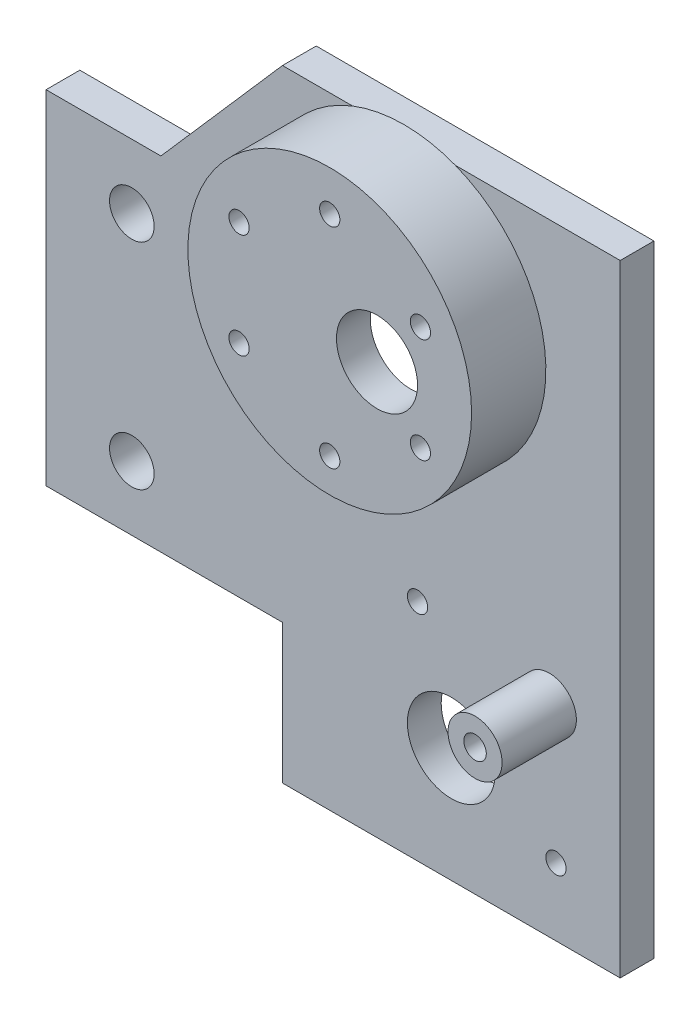
ISO-10303-21;
HEADER;
FILE_DESCRIPTION(('STEP AP214'),'2;1');
FILE_NAME('part.step','',(''),(''),'','','');
FILE_SCHEMA(('AUTOMOTIVE_DESIGN { 1 0 10303 214 1 1 1 1 }'));
ENDSEC;
DATA;
#1=APPLICATION_CONTEXT('core data for automotive mechanical design processes');
#2=APPLICATION_PROTOCOL_DEFINITION('international standard','automotive_design',2000,#1);
#3=PRODUCT_CONTEXT('',#1,'mechanical');
#4=PRODUCT('Part','Part','',(#3));
#5=PRODUCT_RELATED_PRODUCT_CATEGORY('part','',(#4));
#6=PRODUCT_DEFINITION_FORMATION('','',#4);
#7=PRODUCT_DEFINITION_CONTEXT('part definition',#1,'design');
#8=PRODUCT_DEFINITION('design','',#6,#7);
#9=PRODUCT_DEFINITION_SHAPE('','',#8);
#10=(LENGTH_UNIT() NAMED_UNIT(*) SI_UNIT(.MILLI.,.METRE.));
#11=(NAMED_UNIT(*) PLANE_ANGLE_UNIT() SI_UNIT($,.RADIAN.));
#12=(NAMED_UNIT(*) SI_UNIT($,.STERADIAN.) SOLID_ANGLE_UNIT());
#13=UNCERTAINTY_MEASURE_WITH_UNIT(LENGTH_MEASURE(1.E-05),#10,'distance_accuracy_value','');
#14=(GEOMETRIC_REPRESENTATION_CONTEXT(3) GLOBAL_UNCERTAINTY_ASSIGNED_CONTEXT((#13)) GLOBAL_UNIT_ASSIGNED_CONTEXT((#10,
#11,#12)) REPRESENTATION_CONTEXT('',''));
#15=CARTESIAN_POINT('',(0.,0.,0.));
#16=DIRECTION('',(0.,0.,1.));
#17=DIRECTION('',(1.,0.,0.));
#18=AXIS2_PLACEMENT_3D('',#15,#16,#17);
#19=CARTESIAN_POINT('',(-60.,54.4,0.));
#20=DIRECTION('',(0.,-1.,0.));
#21=DIRECTION('',(1.,0.,0.));
#22=AXIS2_PLACEMENT_3D('',#19,#20,#21);
#23=PLANE('',#22);
#24=DIRECTION('',(0.,0.,-1.));
#25=VECTOR('',#24,1.);
#26=CARTESIAN_POINT('',(-42.9961508644975,54.4,32.3536367954565));
#27=LINE('',#26,#25);
#28=CARTESIAN_POINT('',(-42.9961508644975,54.4,4.99999999999999));
#29=VERTEX_POINT('',#28);
#30=CARTESIAN_POINT('',(-42.9961508644975,54.4,0.));
#31=VERTEX_POINT('',#30);
#32=EDGE_CURVE('E60',#29,#31,#27,.T.);
#33=ORIENTED_EDGE('',*,*,#32,.T.);
#34=DIRECTION('',(1.,0.,0.));
#35=VECTOR('',#34,1.);
#36=CARTESIAN_POINT('',(-60.,54.4,0.));
#37=LINE('',#36,#35);
#38=CARTESIAN_POINT('',(-60.,54.4,0.));
#39=VERTEX_POINT('',#38);
#40=EDGE_CURVE('E168',#39,#31,#37,.T.);
#41=ORIENTED_EDGE('',*,*,#40,.F.);
#42=DIRECTION('',(0.,0.,-1.));
#43=VECTOR('',#42,1.);
#44=CARTESIAN_POINT('',(-60.,54.4,0.));
#45=LINE('',#44,#43);
#46=CARTESIAN_POINT('',(-60.,54.4,4.99999999999999));
#47=VERTEX_POINT('',#46);
#48=EDGE_CURVE('E166',#47,#39,#45,.T.);
#49=ORIENTED_EDGE('',*,*,#48,.F.);
#50=DIRECTION('',(1.,0.,0.));
#51=VECTOR('',#50,1.);
#52=CARTESIAN_POINT('',(-60.,54.4,4.99999999999999));
#53=LINE('',#52,#51);
#54=EDGE_CURVE('E56',#47,#29,#53,.T.);
#55=ORIENTED_EDGE('',*,*,#54,.T.);
#56=EDGE_LOOP('',(#33,#41,#49,#55));
#57=FACE_BOUND('',#56,.T.);
#58=ADVANCED_FACE('F40',(#57),#23,.F.);
#59=CARTESIAN_POINT('',(-25.,-45.,-60.));
#60=DIRECTION('',(1.,0.,0.));
#61=DIRECTION('',(0.,1.,0.));
#62=AXIS2_PLACEMENT_3D('',#59,#60,#61);
#63=PLANE('',#62);
#64=DIRECTION('',(0.,0.,1.));
#65=VECTOR('',#64,1.);
#66=CARTESIAN_POINT('',(-25.,3.6,0.));
#67=LINE('',#66,#65);
#68=CARTESIAN_POINT('',(-25.,3.60000000000001,0.));
#69=VERTEX_POINT('',#68);
#70=CARTESIAN_POINT('',(-25.,3.60000000000001,4.99999999999999));
#71=VERTEX_POINT('',#70);
#72=EDGE_CURVE('E153',#69,#71,#67,.T.);
#73=ORIENTED_EDGE('',*,*,#72,.F.);
#74=DIRECTION('',(0.,-1.,0.));
#75=VECTOR('',#74,1.);
#76=CARTESIAN_POINT('',(-25.,-45.,0.));
#77=LINE('',#76,#75);
#78=CARTESIAN_POINT('',(-25.,-17.,0.));
#79=VERTEX_POINT('',#78);
#80=EDGE_CURVE('E192',#69,#79,#77,.T.);
#81=ORIENTED_EDGE('',*,*,#80,.T.);
#82=DIRECTION('',(0.,0.,1.));
#83=VECTOR('',#82,1.);
#84=CARTESIAN_POINT('',(-25.,-17.,-2.49999999929126E-05));
#85=LINE('',#84,#83);
#86=CARTESIAN_POINT('',(-25.,-17.,4.99999999999999));
#87=VERTEX_POINT('',#86);
#88=EDGE_CURVE('E186',#79,#87,#85,.T.);
#89=ORIENTED_EDGE('',*,*,#88,.T.);
#90=DIRECTION('',(0.,1.,0.));
#91=VECTOR('',#90,1.);
#92=CARTESIAN_POINT('',(-25.,25.,4.99999999999999));
#93=LINE('',#92,#91);
#94=EDGE_CURVE('E225',#87,#71,#93,.T.);
#95=ORIENTED_EDGE('',*,*,#94,.T.);
#96=EDGE_LOOP('',(#73,#81,#89,#95));
#97=FACE_BOUND('',#96,.T.);
#98=ADVANCED_FACE('F255',(#97),#63,.F.);
#99=CARTESIAN_POINT('',(-20.,-25.,4.99999999999999));
#100=DIRECTION('',(0.,0.,-1.));
#101=DIRECTION('',(-1.,0.,0.));
#102=AXIS2_PLACEMENT_3D('',#99,#100,#101);
#103=PLANE('',#102);
#104=CARTESIAN_POINT('',(-7.00000000000005,55.425998351102,4.99999999999999));
#105=DIRECTION('',(0.,0.,1.));
#106=DIRECTION('',(1.,0.,0.));
#107=AXIS2_PLACEMENT_3D('',#104,#105,#106);
#108=CIRCLE('',#107,21.);
#109=CARTESIAN_POINT('',(-14.6064748371987,75.,4.99999999999999));
#110=VERTEX_POINT('',#109);
#111=CARTESIAN_POINT('',(0.606474837198628,75.,4.99999999999999));
#112=VERTEX_POINT('',#111);
#113=EDGE_CURVE('E112',#110,#112,#108,.T.);
#114=ORIENTED_EDGE('',*,*,#113,.F.);
#115=DIRECTION('',(1.,0.,0.));
#116=VECTOR('',#115,1.);
#117=CARTESIAN_POINT('',(-25.,75.,4.99999999999999));
#118=LINE('',#117,#116);
#119=CARTESIAN_POINT('',(-25.,75.,4.99999999999999));
#120=VERTEX_POINT('',#119);
#121=EDGE_CURVE('E138',#120,#110,#118,.T.);
#122=ORIENTED_EDGE('',*,*,#121,.F.);
#123=DIRECTION('',(-0.657907063659142,-0.753099127331459,0.));
#124=VECTOR('',#123,1.);
#125=CARTESIAN_POINT('',(-25.,75.,4.99999999999999));
#126=LINE('',#125,#124);
#127=EDGE_CURVE('E631',#120,#29,#126,.T.);
#128=ORIENTED_EDGE('',*,*,#127,.T.);
#129=ORIENTED_EDGE('',*,*,#54,.F.);
#130=DIRECTION('',(0.,1.,0.));
#131=VECTOR('',#130,1.);
#132=CARTESIAN_POINT('',(-60.,54.4,4.99999999999999));
#133=LINE('',#132,#131);
#134=CARTESIAN_POINT('',(-60.,3.6,4.99999999999999));
#135=VERTEX_POINT('',#134);
#136=EDGE_CURVE('E164',#135,#47,#133,.T.);
#137=ORIENTED_EDGE('',*,*,#136,.F.);
#138=DIRECTION('',(1.,0.,0.));
#139=VECTOR('',#138,1.);
#140=CARTESIAN_POINT('',(-60.,3.6,4.99999999999999));
#141=LINE('',#140,#139);
#142=EDGE_CURVE('E173',#135,#71,#141,.T.);
#143=ORIENTED_EDGE('',*,*,#142,.T.);
#144=ORIENTED_EDGE('',*,*,#94,.F.);
#145=DIRECTION('',(-1.,0.,0.));
#146=VECTOR('',#145,1.);
#147=CARTESIAN_POINT('',(-25.,-17.,4.99999999999999));
#148=LINE('',#147,#146);
#149=CARTESIAN_POINT('',(25.,-17.,4.99999999999999));
#150=VERTEX_POINT('',#149);
#151=EDGE_CURVE('E184',#150,#87,#148,.T.);
#152=ORIENTED_EDGE('',*,*,#151,.F.);
#153=DIRECTION('',(0.,1.,0.));
#154=VECTOR('',#153,1.);
#155=CARTESIAN_POINT('',(25.,25.,4.99999999999999));
#156=LINE('',#155,#154);
#157=CARTESIAN_POINT('',(25.,75.,4.99999999999999));
#158=VERTEX_POINT('',#157);
#159=EDGE_CURVE('E134',#150,#158,#156,.T.);
#160=ORIENTED_EDGE('',*,*,#159,.T.);
#161=EDGE_CURVE('E129',#112,#158,#118,.T.);
#162=ORIENTED_EDGE('',*,*,#161,.F.);
#163=EDGE_LOOP('',(#114,#122,#128,#129,#137,#143,#144,#152,#160,#162));
#164=FACE_BOUND('',#163,.T.);
#165=CARTESIAN_POINT('',(-47.3,44.875,4.99999999999999));
#166=DIRECTION('',(0.,0.,1.));
#167=DIRECTION('',(1.,0.,0.));
#168=AXIS2_PLACEMENT_3D('',#165,#166,#167);
#169=CIRCLE('',#168,3.302);
#170=CARTESIAN_POINT('',(-43.998,44.875,4.99999999999999));
#171=VERTEX_POINT('',#170);
#172=EDGE_CURVE('E154',#171,#171,#169,.T.);
#173=ORIENTED_EDGE('',*,*,#172,.F.);
#174=EDGE_LOOP('',(#173));
#175=FACE_BOUND('',#174,.T.);
#176=CARTESIAN_POINT('',(-47.3,13.125,4.99999999999999));
#177=DIRECTION('',(0.,0.,1.));
#178=DIRECTION('',(1.,0.,0.));
#179=AXIS2_PLACEMENT_3D('',#176,#177,#178);
#180=CIRCLE('',#179,3.302);
#181=CARTESIAN_POINT('',(-43.998,13.125,4.99999999999999));
#182=VERTEX_POINT('',#181);
#183=EDGE_CURVE('E142',#182,#182,#180,.T.);
#184=ORIENTED_EDGE('',*,*,#183,.F.);
#185=EDGE_LOOP('',(#184));
#186=FACE_BOUND('',#185,.T.);
#187=CARTESIAN_POINT('',(-4.9969749351771,16.256698357822,4.99999999999999));
#188=DIRECTION('',(0.,0.,-1.));
#189=DIRECTION('',(-1.,0.,0.));
#190=AXIS2_PLACEMENT_3D('',#187,#188,#189);
#191=CIRCLE('',#190,1.49999999999999);
#192=CARTESIAN_POINT('',(-6.49697493517708,16.256698357822,4.99999999999999));
#193=VERTEX_POINT('',#192);
#194=EDGE_CURVE('E197',#193,#193,#191,.T.);
#195=ORIENTED_EDGE('',*,*,#194,.T.);
#196=EDGE_LOOP('',(#195));
#197=FACE_BOUND('',#196,.T.);
#198=CARTESIAN_POINT('',(15.5,-7.,4.99999999999999));
#199=DIRECTION('',(0.,0.,-1.));
#200=DIRECTION('',(-1.,0.,0.));
#201=AXIS2_PLACEMENT_3D('',#198,#199,#200);
#202=CIRCLE('',#201,1.49999999999999);
#203=CARTESIAN_POINT('',(14.,-7.,4.99999999999999));
#204=VERTEX_POINT('',#203);
#205=EDGE_CURVE('E201',#204,#204,#202,.T.);
#206=ORIENTED_EDGE('',*,*,#205,.T.);
#207=EDGE_LOOP('',(#206));
#208=FACE_BOUND('',#207,.T.);
#209=CARTESIAN_POINT('',(0.,0.,4.99999999999999));
#210=DIRECTION('',(0.,0.,-1.));
#211=DIRECTION('',(-1.,0.,0.));
#212=AXIS2_PLACEMENT_3D('',#209,#210,#211);
#213=CIRCLE('',#212,6.49999999999999);
#214=CARTESIAN_POINT('',(-6.49999999999999,0.,4.99999999999999));
#215=VERTEX_POINT('',#214);
#216=EDGE_CURVE('E207',#215,#215,#213,.T.);
#217=ORIENTED_EDGE('',*,*,#216,.T.);
#218=EDGE_LOOP('',(#217));
#219=FACE_BOUND('',#218,.T.);
#220=CARTESIAN_POINT('',(14.5160694680068,12.8487,4.99999999999999));
#221=DIRECTION('',(0.,0.,-1.));
#222=DIRECTION('',(-1.,0.,0.));
#223=AXIS2_PLACEMENT_3D('',#220,#221,#222);
#224=CIRCLE('',#223,4.);
#225=CARTESIAN_POINT('',(10.5160694680068,12.8487,4.99999999999999));
#226=VERTEX_POINT('',#225);
#227=EDGE_CURVE('E49',#226,#226,#224,.F.);
#228=ORIENTED_EDGE('',*,*,#227,.F.);
#229=EDGE_LOOP('',(#228));
#230=FACE_BOUND('',#229,.T.);
#231=ADVANCED_FACE('F130',(#164,#175,#186,#197,#208,#219,#230),#103,.F.);
#232=CARTESIAN_POINT('',(25.,25.,4.99999999999999));
#233=DIRECTION('',(-1.,0.,0.));
#234=DIRECTION('',(0.,-1.,0.));
#235=AXIS2_PLACEMENT_3D('',#232,#233,#234);
#236=PLANE('',#235);
#237=ORIENTED_EDGE('',*,*,#159,.F.);
#238=DIRECTION('',(0.,0.,-1.));
#239=VECTOR('',#238,1.);
#240=CARTESIAN_POINT('',(25.,-17.,4.99999999999999));
#241=LINE('',#240,#239);
#242=CARTESIAN_POINT('',(25.,-17.,0.));
#243=VERTEX_POINT('',#242);
#244=EDGE_CURVE('E189',#150,#243,#241,.T.);
#245=ORIENTED_EDGE('',*,*,#244,.T.);
#246=DIRECTION('',(0.,-1.,0.));
#247=VECTOR('',#246,1.);
#248=CARTESIAN_POINT('',(25.,-22.,0.));
#249=LINE('',#248,#247);
#250=CARTESIAN_POINT('',(25.,75.,0.));
#251=VERTEX_POINT('',#250);
#252=EDGE_CURVE('E228',#243,#251,#249,.F.);
#253=ORIENTED_EDGE('',*,*,#252,.T.);
#254=DIRECTION('',(0.,0.,-1.));
#255=VECTOR('',#254,1.);
#256=CARTESIAN_POINT('',(25.,75.,4.99999999999999));
#257=LINE('',#256,#255);
#258=EDGE_CURVE('E179',#158,#251,#257,.T.);
#259=ORIENTED_EDGE('',*,*,#258,.F.);
#260=EDGE_LOOP('',(#237,#245,#253,#259));
#261=FACE_BOUND('',#260,.T.);
#262=ADVANCED_FACE('F42',(#261),#236,.F.);
#263=CARTESIAN_POINT('',(-20.,25.,0.));
#264=DIRECTION('',(0.,0.,1.));
#265=DIRECTION('',(1.,0.,0.));
#266=AXIS2_PLACEMENT_3D('',#263,#264,#265);
#267=PLANE('',#266);
#268=CARTESIAN_POINT('',(-7.00000000000002,54.940809610506,0.));
#269=DIRECTION('',(0.,0.,-1.));
#270=DIRECTION('',(-1.,0.,0.));
#271=AXIS2_PLACEMENT_3D('',#268,#269,#270);
#272=CIRCLE('',#271,19.);
#273=CARTESIAN_POINT('',(-26.,54.940809610506,0.));
#274=VERTEX_POINT('',#273);
#275=EDGE_CURVE('E637',#274,#274,#272,.T.);
#276=ORIENTED_EDGE('',*,*,#275,.F.);
#277=EDGE_LOOP('',(#276));
#278=FACE_BOUND('',#277,.T.);
#279=CARTESIAN_POINT('',(-47.3,44.875,0.));
#280=DIRECTION('',(0.,0.,1.));
#281=DIRECTION('',(1.,0.,0.));
#282=AXIS2_PLACEMENT_3D('',#279,#280,#281);
#283=CIRCLE('',#282,3.302);
#284=CARTESIAN_POINT('',(-43.998,44.875,0.));
#285=VERTEX_POINT('',#284);
#286=EDGE_CURVE('E150',#285,#285,#283,.T.);
#287=ORIENTED_EDGE('',*,*,#286,.T.);
#288=EDGE_LOOP('',(#287));
#289=FACE_BOUND('',#288,.T.);
#290=CARTESIAN_POINT('',(-47.3,13.125,0.));
#291=DIRECTION('',(0.,0.,1.));
#292=DIRECTION('',(1.,0.,0.));
#293=AXIS2_PLACEMENT_3D('',#290,#291,#292);
#294=CIRCLE('',#293,3.302);
#295=CARTESIAN_POINT('',(-43.998,13.125,0.));
#296=VERTEX_POINT('',#295);
#297=EDGE_CURVE('E145',#296,#296,#294,.T.);
#298=ORIENTED_EDGE('',*,*,#297,.T.);
#299=EDGE_LOOP('',(#298));
#300=FACE_BOUND('',#299,.T.);
#301=ORIENTED_EDGE('',*,*,#40,.T.);
#302=DIRECTION('',(-0.657907063659142,-0.753099127331459,0.));
#303=VECTOR('',#302,1.);
#304=CARTESIAN_POINT('',(-25.,75.,0.));
#305=LINE('',#304,#303);
#306=CARTESIAN_POINT('',(-25.,75.,0.));
#307=VERTEX_POINT('',#306);
#308=EDGE_CURVE('E629',#307,#31,#305,.T.);
#309=ORIENTED_EDGE('',*,*,#308,.F.);
#310=DIRECTION('',(-1.,0.,0.));
#311=VECTOR('',#310,1.);
#312=CARTESIAN_POINT('',(25.,75.,0.));
#313=LINE('',#312,#311);
#314=EDGE_CURVE('E181',#251,#307,#313,.T.);
#315=ORIENTED_EDGE('',*,*,#314,.F.);
#316=ORIENTED_EDGE('',*,*,#252,.F.);
#317=DIRECTION('',(-1.,0.,0.));
#318=VECTOR('',#317,1.);
#319=CARTESIAN_POINT('',(-20.,-17.,0.));
#320=LINE('',#319,#318);
#321=EDGE_CURVE('E13',#243,#79,#320,.T.);
#322=ORIENTED_EDGE('',*,*,#321,.T.);
#323=ORIENTED_EDGE('',*,*,#80,.F.);
#324=DIRECTION('',(1.,0.,0.));
#325=VECTOR('',#324,1.);
#326=CARTESIAN_POINT('',(-60.,3.6,0.));
#327=LINE('',#326,#325);
#328=CARTESIAN_POINT('',(-60.,3.6,0.));
#329=VERTEX_POINT('',#328);
#330=EDGE_CURVE('E176',#329,#69,#327,.T.);
#331=ORIENTED_EDGE('',*,*,#330,.F.);
#332=DIRECTION('',(0.,-1.,0.));
#333=VECTOR('',#332,1.);
#334=CARTESIAN_POINT('',(-60.,54.4,0.));
#335=LINE('',#334,#333);
#336=EDGE_CURVE('E159',#39,#329,#335,.T.);
#337=ORIENTED_EDGE('',*,*,#336,.F.);
#338=EDGE_LOOP('',(#301,#309,#315,#316,#322,#323,#331,#337));
#339=FACE_BOUND('',#338,.T.);
#340=CARTESIAN_POINT('',(-4.9969749351771,16.256698357822,0.));
#341=DIRECTION('',(0.,0.,-1.));
#342=DIRECTION('',(-1.,0.,0.));
#343=AXIS2_PLACEMENT_3D('',#340,#341,#342);
#344=CIRCLE('',#343,1.49999999999999);
#345=CARTESIAN_POINT('',(-6.49697493517708,16.256698357822,0.));
#346=VERTEX_POINT('',#345);
#347=EDGE_CURVE('E194',#346,#346,#344,.T.);
#348=ORIENTED_EDGE('',*,*,#347,.F.);
#349=EDGE_LOOP('',(#348));
#350=FACE_BOUND('',#349,.T.);
#351=CARTESIAN_POINT('',(15.5,-7.,0.));
#352=DIRECTION('',(0.,0.,-1.));
#353=DIRECTION('',(-1.,0.,0.));
#354=AXIS2_PLACEMENT_3D('',#351,#352,#353);
#355=CIRCLE('',#354,1.49999999999999);
#356=CARTESIAN_POINT('',(14.,-7.,0.));
#357=VERTEX_POINT('',#356);
#358=EDGE_CURVE('E198',#357,#357,#355,.T.);
#359=ORIENTED_EDGE('',*,*,#358,.F.);
#360=EDGE_LOOP('',(#359));
#361=FACE_BOUND('',#360,.T.);
#362=CARTESIAN_POINT('',(0.,0.,0.));
#363=DIRECTION('',(0.,0.,-1.));
#364=DIRECTION('',(-1.,0.,0.));
#365=AXIS2_PLACEMENT_3D('',#362,#363,#364);
#366=CIRCLE('',#365,6.49999999999999);
#367=CARTESIAN_POINT('',(-6.49999999999999,0.,0.));
#368=VERTEX_POINT('',#367);
#369=EDGE_CURVE('E204',#368,#368,#366,.T.);
#370=ORIENTED_EDGE('',*,*,#369,.F.);
#371=EDGE_LOOP('',(#370));
#372=FACE_BOUND('',#371,.T.);
#373=CARTESIAN_POINT('',(14.5160694680068,12.8487,0.));
#374=DIRECTION('',(0.,0.,-1.));
#375=DIRECTION('',(-1.,0.,0.));
#376=AXIS2_PLACEMENT_3D('',#373,#374,#375);
#377=CIRCLE('',#376,1.65);
#378=CARTESIAN_POINT('',(12.8660694680068,12.8487,0.));
#379=VERTEX_POINT('',#378);
#380=EDGE_CURVE('E216',#379,#379,#377,.T.);
#381=ORIENTED_EDGE('',*,*,#380,.F.);
#382=EDGE_LOOP('',(#381));
#383=FACE_BOUND('',#382,.T.);
#384=ADVANCED_FACE('F413',(#278,#289,#300,#339,#350,#361,#372,#383),#267,.F.);
#385=CARTESIAN_POINT('',(14.5160694680068,12.8487,16.));
#386=DIRECTION('',(0.,0.,-1.));
#387=DIRECTION('',(-1.,0.,0.));
#388=AXIS2_PLACEMENT_3D('',#385,#386,#387);
#389=CYLINDRICAL_SURFACE('',#388,4.);
#390=CARTESIAN_POINT('',(14.5160694680068,12.8487,16.));
#391=DIRECTION('',(0.,0.,1.));
#392=DIRECTION('',(1.,0.,0.));
#393=AXIS2_PLACEMENT_3D('',#390,#391,#392);
#394=CIRCLE('',#393,4.);
#395=CARTESIAN_POINT('',(18.5160694680068,12.8487,16.));
#396=VERTEX_POINT('',#395);
#397=EDGE_CURVE('E222',#396,#396,#394,.T.);
#398=ORIENTED_EDGE('',*,*,#397,.F.);
#399=EDGE_LOOP('',(#398));
#400=FACE_BOUND('',#399,.T.);
#401=ORIENTED_EDGE('',*,*,#227,.T.);
#402=EDGE_LOOP('',(#401));
#403=FACE_BOUND('',#402,.T.);
#404=ADVANCED_FACE('F419',(#400,#403),#389,.T.);
#405=CARTESIAN_POINT('',(14.5160694680068,12.8487,16.));
#406=DIRECTION('',(0.,0.,1.));
#407=DIRECTION('',(1.,0.,0.));
#408=AXIS2_PLACEMENT_3D('',#405,#406,#407);
#409=PLANE('',#408);
#410=CARTESIAN_POINT('',(14.5160694680068,12.8487,16.));
#411=DIRECTION('',(0.,0.,-1.));
#412=DIRECTION('',(-1.,0.,0.));
#413=AXIS2_PLACEMENT_3D('',#410,#411,#412);
#414=CIRCLE('',#413,1.66179679832295);
#415=CARTESIAN_POINT('',(12.8542726696839,12.8487,16.));
#416=VERTEX_POINT('',#415);
#417=EDGE_CURVE('E219',#416,#416,#414,.T.);
#418=ORIENTED_EDGE('',*,*,#417,.T.);
#419=EDGE_LOOP('',(#418));
#420=FACE_BOUND('',#419,.T.);
#421=ORIENTED_EDGE('',*,*,#397,.T.);
#422=EDGE_LOOP('',(#421));
#423=FACE_BOUND('',#422,.T.);
#424=ADVANCED_FACE('F452',(#420,#423),#409,.T.);
#425=CARTESIAN_POINT('',(14.5160694680068,12.8487,16.));
#426=DIRECTION('',(0.,0.,-1.));
#427=DIRECTION('',(-1.,0.,0.));
#428=AXIS2_PLACEMENT_3D('',#425,#426,#427);
#429=CYLINDRICAL_SURFACE('',#428,1.66179679832295);
#430=ORIENTED_EDGE('',*,*,#417,.F.);
#431=EDGE_LOOP('',(#430));
#432=FACE_BOUND('',#431,.T.);
#433=CARTESIAN_POINT('',(14.5160694680068,12.8487,5.));
#434=DIRECTION('',(0.,0.,-1.));
#435=DIRECTION('',(-1.,0.,0.));
#436=AXIS2_PLACEMENT_3D('',#433,#434,#435);
#437=CIRCLE('',#436,1.66179679832295);
#438=CARTESIAN_POINT('',(12.8542726696839,12.8487,5.));
#439=VERTEX_POINT('',#438);
#440=EDGE_CURVE('E210',#439,#439,#437,.T.);
#441=ORIENTED_EDGE('',*,*,#440,.T.);
#442=EDGE_LOOP('',(#441));
#443=FACE_BOUND('',#442,.T.);
#444=ADVANCED_FACE('F460',(#432,#443),#429,.F.);
#445=CARTESIAN_POINT('',(14.5160694680068,12.8487,16.));
#446=DIRECTION('',(0.,0.,-1.));
#447=DIRECTION('',(-1.,0.,0.));
#448=AXIS2_PLACEMENT_3D('',#445,#446,#447);
#449=CYLINDRICAL_SURFACE('',#448,1.65);
#450=CARTESIAN_POINT('',(14.5160694680068,12.8487,5.));
#451=DIRECTION('',(0.,0.,-1.));
#452=DIRECTION('',(-1.,0.,0.));
#453=AXIS2_PLACEMENT_3D('',#450,#451,#452);
#454=CIRCLE('',#453,1.65);
#455=CARTESIAN_POINT('',(12.8660694680068,12.8487,5.));
#456=VERTEX_POINT('',#455);
#457=EDGE_CURVE('E213',#456,#456,#454,.T.);
#458=ORIENTED_EDGE('',*,*,#457,.F.);
#459=EDGE_LOOP('',(#458));
#460=FACE_BOUND('',#459,.T.);
#461=ORIENTED_EDGE('',*,*,#380,.T.);
#462=EDGE_LOOP('',(#461));
#463=FACE_BOUND('',#462,.T.);
#464=ADVANCED_FACE('F468',(#460,#463),#449,.F.);
#465=CARTESIAN_POINT('',(16.1660694680068,12.8487,5.));
#466=DIRECTION('',(0.,0.,-1.));
#467=DIRECTION('',(-1.,0.,0.));
#468=AXIS2_PLACEMENT_3D('',#465,#466,#467);
#469=PLANE('',#468);
#470=ORIENTED_EDGE('',*,*,#440,.F.);
#471=EDGE_LOOP('',(#470));
#472=FACE_BOUND('',#471,.T.);
#473=ORIENTED_EDGE('',*,*,#457,.T.);
#474=EDGE_LOOP('',(#473));
#475=FACE_BOUND('',#474,.T.);
#476=ADVANCED_FACE('F476',(#472,#475),#469,.F.);
#477=CARTESIAN_POINT('',(0.,0.,0.));
#478=DIRECTION('',(0.,0.,-1.));
#479=DIRECTION('',(-1.,0.,0.));
#480=AXIS2_PLACEMENT_3D('',#477,#478,#479);
#481=CYLINDRICAL_SURFACE('',#480,6.49999999999999);
#482=ORIENTED_EDGE('',*,*,#369,.T.);
#483=EDGE_LOOP('',(#482));
#484=FACE_BOUND('',#483,.T.);
#485=ORIENTED_EDGE('',*,*,#216,.F.);
#486=EDGE_LOOP('',(#485));
#487=FACE_BOUND('',#486,.T.);
#488=ADVANCED_FACE('F251',(#484,#487),#481,.F.);
#489=CARTESIAN_POINT('',(15.5,-7.,0.));
#490=DIRECTION('',(0.,0.,-1.));
#491=DIRECTION('',(-1.,0.,0.));
#492=AXIS2_PLACEMENT_3D('',#489,#490,#491);
#493=CYLINDRICAL_SURFACE('',#492,1.49999999999999);
#494=ORIENTED_EDGE('',*,*,#358,.T.);
#495=EDGE_LOOP('',(#494));
#496=FACE_BOUND('',#495,.T.);
#497=ORIENTED_EDGE('',*,*,#205,.F.);
#498=EDGE_LOOP('',(#497));
#499=FACE_BOUND('',#498,.T.);
#500=ADVANCED_FACE('F242',(#496,#499),#493,.F.);
#501=CARTESIAN_POINT('',(-4.9969749351771,16.256698357822,0.));
#502=DIRECTION('',(0.,0.,-1.));
#503=DIRECTION('',(-1.,0.,0.));
#504=AXIS2_PLACEMENT_3D('',#501,#502,#503);
#505=CYLINDRICAL_SURFACE('',#504,1.49999999999999);
#506=ORIENTED_EDGE('',*,*,#347,.T.);
#507=EDGE_LOOP('',(#506));
#508=FACE_BOUND('',#507,.T.);
#509=ORIENTED_EDGE('',*,*,#194,.F.);
#510=EDGE_LOOP('',(#509));
#511=FACE_BOUND('',#510,.T.);
#512=ADVANCED_FACE('F239',(#508,#511),#505,.F.);
#513=CARTESIAN_POINT('',(-25.,-17.,-2.49999999929126E-05));
#514=DIRECTION('',(0.,1.,0.));
#515=DIRECTION('',(0.,0.,1.));
#516=AXIS2_PLACEMENT_3D('',#513,#514,#515);
#517=PLANE('',#516);
#518=ORIENTED_EDGE('',*,*,#151,.T.);
#519=ORIENTED_EDGE('',*,*,#88,.F.);
#520=ORIENTED_EDGE('',*,*,#321,.F.);
#521=ORIENTED_EDGE('',*,*,#244,.F.);
#522=EDGE_LOOP('',(#518,#519,#520,#521));
#523=FACE_BOUND('',#522,.T.);
#524=ADVANCED_FACE('F241',(#523),#517,.F.);
#525=CARTESIAN_POINT('',(0.,75.,0.));
#526=DIRECTION('',(0.,1.,0.));
#527=DIRECTION('',(-1.,0.,0.));
#528=AXIS2_PLACEMENT_3D('',#525,#526,#527);
#529=PLANE('',#528);
#530=ORIENTED_EDGE('',*,*,#258,.T.);
#531=ORIENTED_EDGE('',*,*,#314,.T.);
#532=DIRECTION('',(0.,0.,1.));
#533=VECTOR('',#532,1.);
#534=CARTESIAN_POINT('',(-25.,75.,0.));
#535=LINE('',#534,#533);
#536=EDGE_CURVE('E139',#307,#120,#535,.T.);
#537=ORIENTED_EDGE('',*,*,#536,.T.);
#538=ORIENTED_EDGE('',*,*,#121,.T.);
#539=DIRECTION('',(1.,0.,0.));
#540=VECTOR('',#539,1.);
#541=CARTESIAN_POINT('',(0.,75.,4.99999999999999));
#542=LINE('',#541,#540);
#543=EDGE_CURVE('E126',#110,#112,#542,.T.);
#544=ORIENTED_EDGE('',*,*,#543,.T.);
#545=ORIENTED_EDGE('',*,*,#161,.T.);
#546=EDGE_LOOP('',(#530,#531,#537,#538,#544,#545));
#547=FACE_BOUND('',#546,.T.);
#548=ADVANCED_FACE('F141',(#547),#529,.T.);
#549=CARTESIAN_POINT('',(6.42339375865882,62.6908096105059,0.));
#550=DIRECTION('',(0.,0.,1.));
#551=DIRECTION('',(1.,0.,0.));
#552=AXIS2_PLACEMENT_3D('',#549,#550,#551);
#553=CYLINDRICAL_SURFACE('',#552,1.5);
#554=CARTESIAN_POINT('',(6.42339375865882,62.6908096105059,11.));
#555=DIRECTION('',(0.,0.,1.));
#556=DIRECTION('',(1.,0.,0.));
#557=AXIS2_PLACEMENT_3D('',#554,#555,#556);
#558=CIRCLE('',#557,1.5);
#559=CARTESIAN_POINT('',(7.92339375865882,62.6908096105059,11.));
#560=VERTEX_POINT('',#559);
#561=EDGE_CURVE('E659',#560,#560,#558,.F.);
#562=ORIENTED_EDGE('',*,*,#561,.T.);
#563=EDGE_LOOP('',(#562));
#564=FACE_BOUND('',#563,.T.);
#565=CARTESIAN_POINT('',(6.42339375865882,62.6908096105059,16.));
#566=DIRECTION('',(0.,0.,-1.));
#567=DIRECTION('',(-1.,0.,0.));
#568=AXIS2_PLACEMENT_3D('',#565,#566,#567);
#569=CIRCLE('',#568,1.5);
#570=CARTESIAN_POINT('',(4.92339375865882,62.6908096105059,16.));
#571=VERTEX_POINT('',#570);
#572=EDGE_CURVE('E662',#571,#571,#569,.T.);
#573=ORIENTED_EDGE('',*,*,#572,.F.);
#574=EDGE_LOOP('',(#573));
#575=FACE_BOUND('',#574,.T.);
#576=ADVANCED_FACE('F283',(#564,#575),#553,.F.);
#577=CARTESIAN_POINT('',(6.42339375865877,47.1908096105059,0.));
#578=DIRECTION('',(0.,0.,1.));
#579=DIRECTION('',(1.,0.,0.));
#580=AXIS2_PLACEMENT_3D('',#577,#578,#579);
#581=CYLINDRICAL_SURFACE('',#580,1.5);
#582=CARTESIAN_POINT('',(6.42339375865877,47.1908096105059,11.));
#583=DIRECTION('',(0.,0.,1.));
#584=DIRECTION('',(1.,0.,0.));
#585=AXIS2_PLACEMENT_3D('',#582,#583,#584);
#586=CIRCLE('',#585,1.5);
#587=CARTESIAN_POINT('',(7.92339375865877,47.1908096105059,11.));
#588=VERTEX_POINT('',#587);
#589=EDGE_CURVE('E656',#588,#588,#586,.F.);
#590=ORIENTED_EDGE('',*,*,#589,.T.);
#591=EDGE_LOOP('',(#590));
#592=FACE_BOUND('',#591,.T.);
#593=CARTESIAN_POINT('',(6.42339375865877,47.1908096105059,16.));
#594=DIRECTION('',(0.,0.,-1.));
#595=DIRECTION('',(-1.,0.,0.));
#596=AXIS2_PLACEMENT_3D('',#593,#594,#595);
#597=CIRCLE('',#596,1.5);
#598=CARTESIAN_POINT('',(4.92339375865877,47.1908096105059,16.));
#599=VERTEX_POINT('',#598);
#600=EDGE_CURVE('E121',#599,#599,#597,.T.);
#601=ORIENTED_EDGE('',*,*,#600,.F.);
#602=EDGE_LOOP('',(#601));
#603=FACE_BOUND('',#602,.T.);
#604=ADVANCED_FACE('F286',(#592,#603),#581,.F.);
#605=CARTESIAN_POINT('',(-7.0000000000001,39.4408096105059,0.));
#606=DIRECTION('',(0.,0.,1.));
#607=DIRECTION('',(1.,0.,0.));
#608=AXIS2_PLACEMENT_3D('',#605,#606,#607);
#609=CYLINDRICAL_SURFACE('',#608,1.5);
#610=CARTESIAN_POINT('',(-7.0000000000001,39.4408096105059,11.));
#611=DIRECTION('',(0.,0.,1.));
#612=DIRECTION('',(1.,0.,0.));
#613=AXIS2_PLACEMENT_3D('',#610,#611,#612);
#614=CIRCLE('',#613,1.5);
#615=CARTESIAN_POINT('',(-5.5000000000001,39.4408096105059,11.));
#616=VERTEX_POINT('',#615);
#617=EDGE_CURVE('E653',#616,#616,#614,.F.);
#618=ORIENTED_EDGE('',*,*,#617,.T.);
#619=EDGE_LOOP('',(#618));
#620=FACE_BOUND('',#619,.T.);
#621=CARTESIAN_POINT('',(-7.0000000000001,39.4408096105059,16.));
#622=DIRECTION('',(0.,0.,-1.));
#623=DIRECTION('',(-1.,0.,0.));
#624=AXIS2_PLACEMENT_3D('',#621,#622,#623);
#625=CIRCLE('',#624,1.5);
#626=CARTESIAN_POINT('',(-8.5000000000001,39.4408096105059,16.));
#627=VERTEX_POINT('',#626);
#628=EDGE_CURVE('E669',#627,#627,#625,.T.);
#629=ORIENTED_EDGE('',*,*,#628,.F.);
#630=EDGE_LOOP('',(#629));
#631=FACE_BOUND('',#630,.T.);
#632=ADVANCED_FACE('F290',(#620,#631),#609,.F.);
#633=CARTESIAN_POINT('',(-20.4233937586589,47.1908096105061,0.));
#634=DIRECTION('',(0.,0.,1.));
#635=DIRECTION('',(1.,0.,0.));
#636=AXIS2_PLACEMENT_3D('',#633,#634,#635);
#637=CYLINDRICAL_SURFACE('',#636,1.5);
#638=CARTESIAN_POINT('',(-20.4233937586589,47.1908096105061,11.));
#639=DIRECTION('',(0.,0.,1.));
#640=DIRECTION('',(1.,0.,0.));
#641=AXIS2_PLACEMENT_3D('',#638,#639,#640);
#642=CIRCLE('',#641,1.5);
#643=CARTESIAN_POINT('',(-18.9233937586589,47.1908096105061,11.));
#644=VERTEX_POINT('',#643);
#645=EDGE_CURVE('E650',#644,#644,#642,.F.);
#646=ORIENTED_EDGE('',*,*,#645,.T.);
#647=EDGE_LOOP('',(#646));
#648=FACE_BOUND('',#647,.T.);
#649=CARTESIAN_POINT('',(-20.4233937586589,47.1908096105061,16.));
#650=DIRECTION('',(0.,0.,-1.));
#651=DIRECTION('',(-1.,0.,0.));
#652=AXIS2_PLACEMENT_3D('',#649,#650,#651);
#653=CIRCLE('',#652,1.5);
#654=CARTESIAN_POINT('',(-21.9233937586589,47.1908096105061,16.));
#655=VERTEX_POINT('',#654);
#656=EDGE_CURVE('E672',#655,#655,#653,.T.);
#657=ORIENTED_EDGE('',*,*,#656,.F.);
#658=EDGE_LOOP('',(#657));
#659=FACE_BOUND('',#658,.T.);
#660=ADVANCED_FACE('F278',(#648,#659),#637,.F.);
#661=CARTESIAN_POINT('',(-20.4233937586587,62.6908096105061,0.));
#662=DIRECTION('',(0.,0.,1.));
#663=DIRECTION('',(1.,0.,0.));
#664=AXIS2_PLACEMENT_3D('',#661,#662,#663);
#665=CYLINDRICAL_SURFACE('',#664,1.5);
#666=CARTESIAN_POINT('',(-20.4233937586587,62.6908096105061,11.));
#667=DIRECTION('',(0.,0.,1.));
#668=DIRECTION('',(1.,0.,0.));
#669=AXIS2_PLACEMENT_3D('',#666,#667,#668);
#670=CIRCLE('',#669,1.5);
#671=CARTESIAN_POINT('',(-18.9233937586587,62.6908096105061,11.));
#672=VERTEX_POINT('',#671);
#673=EDGE_CURVE('E647',#672,#672,#670,.F.);
#674=ORIENTED_EDGE('',*,*,#673,.T.);
#675=EDGE_LOOP('',(#674));
#676=FACE_BOUND('',#675,.T.);
#677=CARTESIAN_POINT('',(-20.4233937586587,62.6908096105061,16.));
#678=DIRECTION('',(0.,0.,-1.));
#679=DIRECTION('',(-1.,0.,0.));
#680=AXIS2_PLACEMENT_3D('',#677,#678,#679);
#681=CIRCLE('',#680,1.5);
#682=CARTESIAN_POINT('',(-21.9233937586587,62.6908096105061,16.));
#683=VERTEX_POINT('',#682);
#684=EDGE_CURVE('E675',#683,#683,#681,.T.);
#685=ORIENTED_EDGE('',*,*,#684,.F.);
#686=EDGE_LOOP('',(#685));
#687=FACE_BOUND('',#686,.T.);
#688=ADVANCED_FACE('F275',(#676,#687),#665,.F.);
#689=CARTESIAN_POINT('',(0.,55.,0.));
#690=DIRECTION('',(0.,0.,1.));
#691=DIRECTION('',(1.,0.,0.));
#692=AXIS2_PLACEMENT_3D('',#689,#690,#691);
#693=CYLINDRICAL_SURFACE('',#692,6.);
#694=CARTESIAN_POINT('',(0.,55.,11.));
#695=DIRECTION('',(0.,0.,1.));
#696=DIRECTION('',(1.,0.,0.));
#697=AXIS2_PLACEMENT_3D('',#694,#695,#696);
#698=CIRCLE('',#697,6.);
#699=CARTESIAN_POINT('',(6.00000000000001,55.,11.));
#700=VERTEX_POINT('',#699);
#701=EDGE_CURVE('E644',#700,#700,#698,.F.);
#702=ORIENTED_EDGE('',*,*,#701,.T.);
#703=EDGE_LOOP('',(#702));
#704=FACE_BOUND('',#703,.T.);
#705=CARTESIAN_POINT('',(0.,55.,16.));
#706=DIRECTION('',(0.,0.,-1.));
#707=DIRECTION('',(-1.,0.,0.));
#708=AXIS2_PLACEMENT_3D('',#705,#706,#707);
#709=CIRCLE('',#708,6.);
#710=CARTESIAN_POINT('',(-5.99999999999999,55.,16.));
#711=VERTEX_POINT('',#710);
#712=EDGE_CURVE('E666',#711,#711,#709,.T.);
#713=ORIENTED_EDGE('',*,*,#712,.F.);
#714=EDGE_LOOP('',(#713));
#715=FACE_BOUND('',#714,.T.);
#716=ADVANCED_FACE('F273',(#704,#715),#693,.F.);
#717=CARTESIAN_POINT('',(-6.99999999999999,70.440809610506,0.));
#718=DIRECTION('',(0.,0.,1.));
#719=DIRECTION('',(1.,0.,0.));
#720=AXIS2_PLACEMENT_3D('',#717,#718,#719);
#721=CYLINDRICAL_SURFACE('',#720,1.5);
#722=CARTESIAN_POINT('',(-6.99999999999999,70.440809610506,11.));
#723=DIRECTION('',(0.,0.,1.));
#724=DIRECTION('',(1.,0.,0.));
#725=AXIS2_PLACEMENT_3D('',#722,#723,#724);
#726=CIRCLE('',#725,1.5);
#727=CARTESIAN_POINT('',(-5.49999999999999,70.440809610506,11.));
#728=VERTEX_POINT('',#727);
#729=EDGE_CURVE('E44',#728,#728,#726,.F.);
#730=ORIENTED_EDGE('',*,*,#729,.T.);
#731=EDGE_LOOP('',(#730));
#732=FACE_BOUND('',#731,.T.);
#733=CARTESIAN_POINT('',(-6.99999999999999,70.440809610506,16.));
#734=DIRECTION('',(0.,0.,-1.));
#735=DIRECTION('',(-1.,0.,0.));
#736=AXIS2_PLACEMENT_3D('',#733,#734,#735);
#737=CIRCLE('',#736,1.5);
#738=CARTESIAN_POINT('',(-8.5,70.440809610506,16.));
#739=VERTEX_POINT('',#738);
#740=EDGE_CURVE('E663',#739,#739,#737,.T.);
#741=ORIENTED_EDGE('',*,*,#740,.F.);
#742=EDGE_LOOP('',(#741));
#743=FACE_BOUND('',#742,.T.);
#744=ADVANCED_FACE('F269',(#732,#743),#721,.F.);
#745=CARTESIAN_POINT('',(-60.,3.6,0.));
#746=DIRECTION('',(0.,1.,0.));
#747=DIRECTION('',(0.,0.,1.));
#748=AXIS2_PLACEMENT_3D('',#745,#746,#747);
#749=PLANE('',#748);
#750=ORIENTED_EDGE('',*,*,#72,.T.);
#751=ORIENTED_EDGE('',*,*,#142,.F.);
#752=DIRECTION('',(0.,0.,1.));
#753=VECTOR('',#752,1.);
#754=CARTESIAN_POINT('',(-60.,3.6,0.));
#755=LINE('',#754,#753);
#756=EDGE_CURVE('E162',#329,#135,#755,.T.);
#757=ORIENTED_EDGE('',*,*,#756,.F.);
#758=ORIENTED_EDGE('',*,*,#330,.T.);
#759=EDGE_LOOP('',(#750,#751,#757,#758));
#760=FACE_BOUND('',#759,.T.);
#761=ADVANCED_FACE('F266',(#760),#749,.F.);
#762=CARTESIAN_POINT('',(-60.,0.,0.));
#763=DIRECTION('',(-1.,0.,0.));
#764=DIRECTION('',(0.,-1.,0.));
#765=AXIS2_PLACEMENT_3D('',#762,#763,#764);
#766=PLANE('',#765);
#767=ORIENTED_EDGE('',*,*,#336,.T.);
#768=ORIENTED_EDGE('',*,*,#756,.T.);
#769=ORIENTED_EDGE('',*,*,#136,.T.);
#770=ORIENTED_EDGE('',*,*,#48,.T.);
#771=EDGE_LOOP('',(#767,#768,#769,#770));
#772=FACE_BOUND('',#771,.T.);
#773=ADVANCED_FACE('F264',(#772),#766,.T.);
#774=CARTESIAN_POINT('',(-47.3,13.125,0.));
#775=DIRECTION('',(0.,0.,1.));
#776=DIRECTION('',(1.,0.,0.));
#777=AXIS2_PLACEMENT_3D('',#774,#775,#776);
#778=CYLINDRICAL_SURFACE('',#777,3.302);
#779=ORIENTED_EDGE('',*,*,#297,.F.);
#780=EDGE_LOOP('',(#779));
#781=FACE_BOUND('',#780,.T.);
#782=ORIENTED_EDGE('',*,*,#183,.T.);
#783=EDGE_LOOP('',(#782));
#784=FACE_BOUND('',#783,.T.);
#785=ADVANCED_FACE('F346',(#781,#784),#778,.F.);
#786=CARTESIAN_POINT('',(-47.3,44.875,0.));
#787=DIRECTION('',(0.,0.,1.));
#788=DIRECTION('',(1.,0.,0.));
#789=AXIS2_PLACEMENT_3D('',#786,#787,#788);
#790=CYLINDRICAL_SURFACE('',#789,3.302);
#791=ORIENTED_EDGE('',*,*,#286,.F.);
#792=EDGE_LOOP('',(#791));
#793=FACE_BOUND('',#792,.T.);
#794=ORIENTED_EDGE('',*,*,#172,.T.);
#795=EDGE_LOOP('',(#794));
#796=FACE_BOUND('',#795,.T.);
#797=ADVANCED_FACE('F353',(#793,#796),#790,.F.);
#798=CARTESIAN_POINT('',(14.5160694680068,12.8487,16.));
#799=DIRECTION('',(0.,0.,1.));
#800=DIRECTION('',(1.,0.,0.));
#801=AXIS2_PLACEMENT_3D('',#798,#799,#800);
#802=PLANE('',#801);
#803=ORIENTED_EDGE('',*,*,#628,.T.);
#804=EDGE_LOOP('',(#803));
#805=FACE_BOUND('',#804,.T.);
#806=ORIENTED_EDGE('',*,*,#656,.T.);
#807=EDGE_LOOP('',(#806));
#808=FACE_BOUND('',#807,.T.);
#809=ORIENTED_EDGE('',*,*,#684,.T.);
#810=EDGE_LOOP('',(#809));
#811=FACE_BOUND('',#810,.T.);
#812=ORIENTED_EDGE('',*,*,#712,.T.);
#813=EDGE_LOOP('',(#812));
#814=FACE_BOUND('',#813,.T.);
#815=ORIENTED_EDGE('',*,*,#740,.T.);
#816=EDGE_LOOP('',(#815));
#817=FACE_BOUND('',#816,.T.);
#818=ORIENTED_EDGE('',*,*,#572,.T.);
#819=EDGE_LOOP('',(#818));
#820=FACE_BOUND('',#819,.T.);
#821=ORIENTED_EDGE('',*,*,#600,.T.);
#822=EDGE_LOOP('',(#821));
#823=FACE_BOUND('',#822,.T.);
#824=CARTESIAN_POINT('',(-7.00000000000005,55.425998351102,16.));
#825=DIRECTION('',(0.,0.,1.));
#826=DIRECTION('',(1.,0.,0.));
#827=AXIS2_PLACEMENT_3D('',#824,#825,#826);
#828=CIRCLE('',#827,21.);
#829=CARTESIAN_POINT('',(14.,55.425998351102,16.));
#830=VERTEX_POINT('',#829);
#831=EDGE_CURVE('E127',#830,#830,#828,.T.);
#832=ORIENTED_EDGE('',*,*,#831,.T.);
#833=EDGE_LOOP('',(#832));
#834=FACE_BOUND('',#833,.T.);
#835=ADVANCED_FACE('F360',(#805,#808,#811,#814,#817,#820,#823,#834),#802,.T.);
#836=CARTESIAN_POINT('',(-7.00000000000005,55.425998351102,4.99999999999999));
#837=DIRECTION('',(0.,0.,1.));
#838=DIRECTION('',(1.,0.,0.));
#839=AXIS2_PLACEMENT_3D('',#836,#837,#838);
#840=PLANE('',#839);
#841=ORIENTED_EDGE('',*,*,#543,.F.);
#842=EDGE_CURVE('E116',#112,#110,#108,.T.);
#843=ORIENTED_EDGE('',*,*,#842,.F.);
#844=EDGE_LOOP('',(#841,#843));
#845=FACE_BOUND('',#844,.T.);
#846=ADVANCED_FACE('F124',(#845),#840,.F.);
#847=CARTESIAN_POINT('',(-7.00000000000005,55.425998351102,75.39696961967));
#848=DIRECTION('',(0.,0.,-1.));
#849=DIRECTION('',(-1.,0.,0.));
#850=AXIS2_PLACEMENT_3D('',#847,#848,#849);
#851=CYLINDRICAL_SURFACE('',#850,21.);
#852=ORIENTED_EDGE('',*,*,#842,.T.);
#853=ORIENTED_EDGE('',*,*,#113,.T.);
#854=EDGE_LOOP('',(#852,#853));
#855=FACE_BOUND('',#854,.T.);
#856=ORIENTED_EDGE('',*,*,#831,.F.);
#857=EDGE_LOOP('',(#856));
#858=FACE_BOUND('',#857,.T.);
#859=ADVANCED_FACE('F114',(#855,#858),#851,.T.);
#860=CARTESIAN_POINT('',(14.5160694680068,12.8487,11.));
#861=DIRECTION('',(0.,0.,1.));
#862=DIRECTION('',(1.,0.,0.));
#863=AXIS2_PLACEMENT_3D('',#860,#861,#862);
#864=PLANE('',#863);
#865=ORIENTED_EDGE('',*,*,#589,.F.);
#866=EDGE_LOOP('',(#865));
#867=FACE_BOUND('',#866,.T.);
#868=ORIENTED_EDGE('',*,*,#645,.F.);
#869=EDGE_LOOP('',(#868));
#870=FACE_BOUND('',#869,.T.);
#871=ORIENTED_EDGE('',*,*,#701,.F.);
#872=EDGE_LOOP('',(#871));
#873=FACE_BOUND('',#872,.T.);
#874=CARTESIAN_POINT('',(-7.00000000000002,54.940809610506,11.));
#875=DIRECTION('',(0.,0.,1.));
#876=DIRECTION('',(1.,0.,0.));
#877=AXIS2_PLACEMENT_3D('',#874,#875,#876);
#878=CIRCLE('',#877,19.);
#879=CARTESIAN_POINT('',(12.,54.940809610506,11.));
#880=VERTEX_POINT('',#879);
#881=EDGE_CURVE('E641',#880,#880,#878,.F.);
#882=ORIENTED_EDGE('',*,*,#881,.T.);
#883=EDGE_LOOP('',(#882));
#884=FACE_BOUND('',#883,.T.);
#885=ORIENTED_EDGE('',*,*,#729,.F.);
#886=EDGE_LOOP('',(#885));
#887=FACE_BOUND('',#886,.T.);
#888=ORIENTED_EDGE('',*,*,#673,.F.);
#889=EDGE_LOOP('',(#888));
#890=FACE_BOUND('',#889,.T.);
#891=ORIENTED_EDGE('',*,*,#617,.F.);
#892=EDGE_LOOP('',(#891));
#893=FACE_BOUND('',#892,.T.);
#894=ORIENTED_EDGE('',*,*,#561,.F.);
#895=EDGE_LOOP('',(#894));
#896=FACE_BOUND('',#895,.T.);
#897=ADVANCED_FACE('F379',(#867,#870,#873,#884,#887,#890,#893,#896),#864,.F.);
#898=CARTESIAN_POINT('',(-7.00000000000002,54.940809610506,69.7401153701776));
#899=DIRECTION('',(0.,0.,-1.));
#900=DIRECTION('',(-1.,0.,0.));
#901=AXIS2_PLACEMENT_3D('',#898,#899,#900);
#902=CYLINDRICAL_SURFACE('',#901,19.);
#903=ORIENTED_EDGE('',*,*,#275,.T.);
#904=EDGE_LOOP('',(#903));
#905=FACE_BOUND('',#904,.T.);
#906=ORIENTED_EDGE('',*,*,#881,.F.);
#907=EDGE_LOOP('',(#906));
#908=FACE_BOUND('',#907,.T.);
#909=ADVANCED_FACE('F386',(#905,#908),#902,.F.);
#910=CARTESIAN_POINT('',(-25.,75.,32.3536367954565));
#911=DIRECTION('',(0.753099127331459,-0.657907063659142,0.));
#912=DIRECTION('',(0.657907063659142,0.753099127331459,0.));
#913=AXIS2_PLACEMENT_3D('',#910,#911,#912);
#914=PLANE('',#913);
#915=ORIENTED_EDGE('',*,*,#127,.F.);
#916=ORIENTED_EDGE('',*,*,#536,.F.);
#917=ORIENTED_EDGE('',*,*,#308,.T.);
#918=ORIENTED_EDGE('',*,*,#32,.F.);
#919=EDGE_LOOP('',(#915,#916,#917,#918));
#920=FACE_BOUND('',#919,.T.);
#921=ADVANCED_FACE('F393',(#920),#914,.F.);
#922=CLOSED_SHELL('',(#58,#98,#231,#262,#384,#404,#424,#444,#464,#476,#488,#500,#512,#524,#548,
#576,#604,#632,#660,#688,#716,#744,#761,#773,#785,#797,#835,#846,#859,#897,#909,#921));
#923=MANIFOLD_SOLID_BREP('B2',#922);
#924=ADVANCED_BREP_SHAPE_REPRESENTATION('',(#18,#923),#14);
#925=SHAPE_DEFINITION_REPRESENTATION(#9,#924);
ENDSEC;
END-ISO-10303-21;
